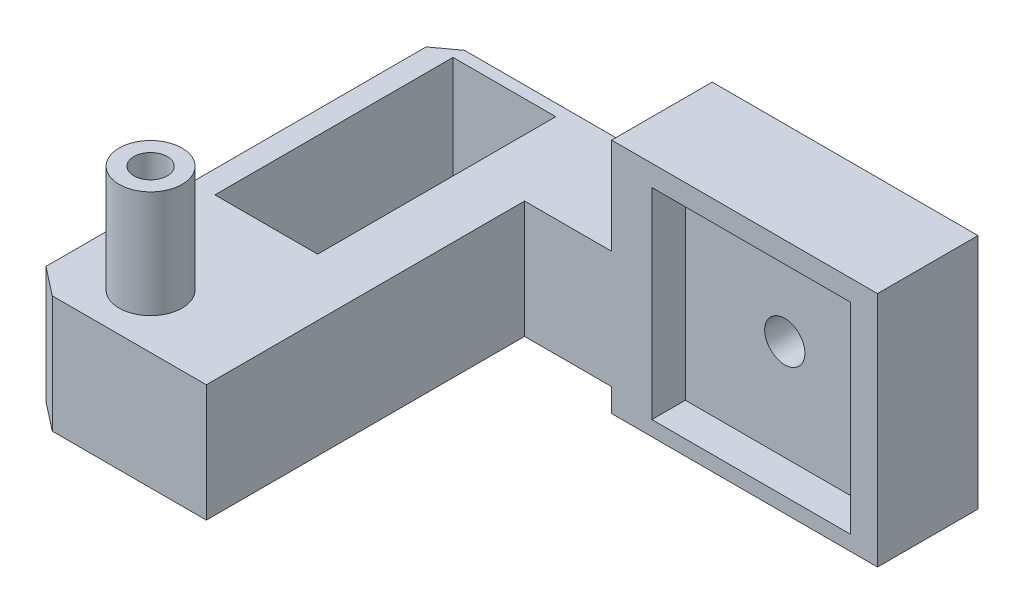
ISO-10303-21;
HEADER;
FILE_DESCRIPTION(('STEP AP214'),'2;1');
FILE_NAME('part.step','',(''),(''),'','','');
FILE_SCHEMA(('AUTOMOTIVE_DESIGN { 1 0 10303 214 1 1 1 1 }'));
ENDSEC;
DATA;
#1=APPLICATION_CONTEXT('core data for automotive mechanical design processes');
#2=APPLICATION_PROTOCOL_DEFINITION('international standard','automotive_design',2000,#1);
#3=PRODUCT_CONTEXT('',#1,'mechanical');
#4=PRODUCT('Part','Part','',(#3));
#5=PRODUCT_RELATED_PRODUCT_CATEGORY('part','',(#4));
#6=PRODUCT_DEFINITION_FORMATION('','',#4);
#7=PRODUCT_DEFINITION_CONTEXT('part definition',#1,'design');
#8=PRODUCT_DEFINITION('design','',#6,#7);
#9=PRODUCT_DEFINITION_SHAPE('','',#8);
#10=(LENGTH_UNIT() NAMED_UNIT(*) SI_UNIT(.MILLI.,.METRE.));
#11=(NAMED_UNIT(*) PLANE_ANGLE_UNIT() SI_UNIT($,.RADIAN.));
#12=(NAMED_UNIT(*) SI_UNIT($,.STERADIAN.) SOLID_ANGLE_UNIT());
#13=UNCERTAINTY_MEASURE_WITH_UNIT(LENGTH_MEASURE(1.E-05),#10,'distance_accuracy_value','');
#14=(GEOMETRIC_REPRESENTATION_CONTEXT(3) GLOBAL_UNCERTAINTY_ASSIGNED_CONTEXT((#13)) GLOBAL_UNIT_ASSIGNED_CONTEXT((#10,
#11,#12)) REPRESENTATION_CONTEXT('',''));
#15=CARTESIAN_POINT('',(0.,0.,0.));
#16=DIRECTION('',(0.,0.,1.));
#17=DIRECTION('',(1.,0.,0.));
#18=AXIS2_PLACEMENT_3D('',#15,#16,#17);
#19=CARTESIAN_POINT('',(-41.2496020360594,-0.64025842156578,0.));
#20=DIRECTION('',(0.,0.,-1.));
#21=DIRECTION('',(-1.,0.,0.));
#22=AXIS2_PLACEMENT_3D('',#19,#20,#21);
#23=PLANE('',#22);
#24=CARTESIAN_POINT('',(-19.4108071751715,13.1097415784342,0.));
#25=DIRECTION('',(0.,0.,1.));
#26=DIRECTION('',(1.,0.,0.));
#27=AXIS2_PLACEMENT_3D('',#24,#25,#26);
#28=CIRCLE('',#27,3.);
#29=CARTESIAN_POINT('',(-16.4108071751715,13.1097415784342,0.));
#30=VERTEX_POINT('',#29);
#31=EDGE_CURVE('E274',#30,#30,#28,.T.);
#32=ORIENTED_EDGE('',*,*,#31,.T.);
#33=EDGE_LOOP('',(#32));
#34=FACE_BOUND('',#33,.T.);
#35=DIRECTION('',(0.,-1.,0.));
#36=VECTOR('',#35,1.);
#37=CARTESIAN_POINT('',(-40.2496020360594,-0.640258421565783,0.));
#38=LINE('',#37,#36);
#39=CARTESIAN_POINT('',(-40.2496020360594,-0.640258421565783,0.));
#40=VERTEX_POINT('',#39);
#41=CARTESIAN_POINT('',(-40.2496020360594,-4.11880183674536,0.));
#42=VERTEX_POINT('',#41);
#43=EDGE_CURVE('E282',#40,#42,#38,.T.);
#44=ORIENTED_EDGE('',*,*,#43,.F.);
#45=DIRECTION('',(-1.,0.,0.));
#46=VECTOR('',#45,1.);
#47=CARTESIAN_POINT('',(-41.2496020360594,-0.64025842156578,0.));
#48=LINE('',#47,#46);
#49=CARTESIAN_POINT('',(-77.2205527939733,-0.64025842156578,0.));
#50=VERTEX_POINT('',#49);
#51=EDGE_CURVE('E410',#40,#50,#48,.T.);
#52=ORIENTED_EDGE('',*,*,#51,.T.);
#53=DIRECTION('',(0.,1.,0.));
#54=VECTOR('',#53,1.);
#55=CARTESIAN_POINT('',(-77.2205527939733,-38.1402584215658,0.));
#56=LINE('',#55,#54);
#57=CARTESIAN_POINT('',(-77.2205527939733,16.8597415784342,0.));
#58=VERTEX_POINT('',#57);
#59=EDGE_CURVE('E404',#50,#58,#56,.T.);
#60=ORIENTED_EDGE('',*,*,#59,.T.);
#61=DIRECTION('',(-1.,0.,0.));
#62=VECTOR('',#61,1.);
#63=CARTESIAN_POINT('',(-41.2496020360594,16.8597415784342,0.));
#64=LINE('',#63,#62);
#65=CARTESIAN_POINT('',(-40.2496020360594,16.8597415784342,0.));
#66=VERTEX_POINT('',#65);
#67=EDGE_CURVE('E409',#66,#58,#64,.T.);
#68=ORIENTED_EDGE('',*,*,#67,.F.);
#69=DIRECTION('',(0.,-1.,0.));
#70=VECTOR('',#69,1.);
#71=CARTESIAN_POINT('',(-40.2496020360594,26.2347415784342,0.));
#72=LINE('',#71,#70);
#73=CARTESIAN_POINT('',(-40.2496020360594,31.2347415784342,0.));
#74=VERTEX_POINT('',#73);
#75=EDGE_CURVE('E330',#74,#66,#72,.T.);
#76=ORIENTED_EDGE('',*,*,#75,.F.);
#77=DIRECTION('',(-1.,0.,0.));
#78=VECTOR('',#77,1.);
#79=CARTESIAN_POINT('',(-40.2496020360594,31.2347415784342,0.));
#80=LINE('',#79,#78);
#81=CARTESIAN_POINT('',(-0.572012314283669,31.2347415784342,0.));
#82=VERTEX_POINT('',#81);
#83=EDGE_CURVE('E315',#82,#74,#80,.T.);
#84=ORIENTED_EDGE('',*,*,#83,.F.);
#85=DIRECTION('',(0.,1.,0.));
#86=VECTOR('',#85,1.);
#87=CARTESIAN_POINT('',(-0.572012314283669,31.2347415784342,0.));
#88=LINE('',#87,#86);
#89=CARTESIAN_POINT('',(-0.572012314283663,-4.11880183674536,0.));
#90=VERTEX_POINT('',#89);
#91=EDGE_CURVE('E266',#90,#82,#88,.T.);
#92=ORIENTED_EDGE('',*,*,#91,.F.);
#93=DIRECTION('',(1.,0.,0.));
#94=VECTOR('',#93,1.);
#95=CARTESIAN_POINT('',(-40.2496020360594,-4.11880183674536,0.));
#96=LINE('',#95,#94);
#97=EDGE_CURVE('E256',#42,#90,#96,.T.);
#98=ORIENTED_EDGE('',*,*,#97,.F.);
#99=EDGE_LOOP('',(#44,#52,#60,#68,#76,#84,#92,#98));
#100=FACE_BOUND('',#99,.T.);
#101=ADVANCED_FACE('F107',(#34,#100),#23,.T.);
#102=CARTESIAN_POINT('',(0.,0.,15.));
#103=DIRECTION('',(0.,0.,1.));
#104=DIRECTION('',(1.,0.,0.));
#105=AXIS2_PLACEMENT_3D('',#102,#103,#104);
#106=PLANE('',#105);
#107=DIRECTION('',(-1.,0.,0.));
#108=VECTOR('',#107,1.);
#109=CARTESIAN_POINT('',(-34.2496020360594,28.1097415784342,15.));
#110=LINE('',#109,#108);
#111=CARTESIAN_POINT('',(-4.57201231428367,28.1097415784342,15.));
#112=VERTEX_POINT('',#111);
#113=CARTESIAN_POINT('',(-34.2496020360594,28.1097415784342,15.));
#114=VERTEX_POINT('',#113);
#115=EDGE_CURVE('E296',#112,#114,#110,.T.);
#116=ORIENTED_EDGE('',*,*,#115,.F.);
#117=DIRECTION('',(0.,-1.,0.));
#118=VECTOR('',#117,1.);
#119=CARTESIAN_POINT('',(-4.57201231428367,31.2347415784342,15.));
#120=LINE('',#119,#118);
#121=CARTESIAN_POINT('',(-4.57201231428366,-1.89025842156578,15.));
#122=VERTEX_POINT('',#121);
#123=EDGE_CURVE('E271',#112,#122,#120,.T.);
#124=ORIENTED_EDGE('',*,*,#123,.T.);
#125=DIRECTION('',(1.,0.,0.));
#126=VECTOR('',#125,1.);
#127=CARTESIAN_POINT('',(-34.2496020360594,-1.89025842156578,15.));
#128=LINE('',#127,#126);
#129=CARTESIAN_POINT('',(-34.2496020360594,-1.89025842156578,15.));
#130=VERTEX_POINT('',#129);
#131=EDGE_CURVE('E303',#130,#122,#128,.T.);
#132=ORIENTED_EDGE('',*,*,#131,.F.);
#133=DIRECTION('',(0.,-1.,0.));
#134=VECTOR('',#133,1.);
#135=CARTESIAN_POINT('',(-34.2496020360594,28.1097415784342,15.));
#136=LINE('',#135,#134);
#137=EDGE_CURVE('E293',#114,#130,#136,.T.);
#138=ORIENTED_EDGE('',*,*,#137,.F.);
#139=EDGE_LOOP('',(#116,#124,#132,#138));
#140=FACE_BOUND('',#139,.T.);
#141=DIRECTION('',(0.,1.,0.));
#142=VECTOR('',#141,1.);
#143=CARTESIAN_POINT('',(-53.2496020360594,-19.3902584215658,15.));
#144=LINE('',#143,#142);
#145=CARTESIAN_POINT('',(-53.2496020360594,-0.640258421565783,15.));
#146=VERTEX_POINT('',#145);
#147=CARTESIAN_POINT('',(-53.2496020360594,16.8597415784342,15.));
#148=VERTEX_POINT('',#147);
#149=EDGE_CURVE('E352',#146,#148,#144,.T.);
#150=ORIENTED_EDGE('',*,*,#149,.F.);
#151=DIRECTION('',(1.,0.,0.));
#152=VECTOR('',#151,1.);
#153=CARTESIAN_POINT('',(-53.2496020360594,-0.640258421565783,15.));
#154=LINE('',#153,#152);
#155=CARTESIAN_POINT('',(-40.2496020360594,-0.640258421565783,15.));
#156=VERTEX_POINT('',#155);
#157=EDGE_CURVE('E286',#146,#156,#154,.T.);
#158=ORIENTED_EDGE('',*,*,#157,.T.);
#159=DIRECTION('',(0.,-1.,0.));
#160=VECTOR('',#159,1.);
#161=CARTESIAN_POINT('',(-40.2496020360594,-0.640258421565783,15.));
#162=LINE('',#161,#160);
#163=CARTESIAN_POINT('',(-40.2496020360594,-4.11880183674536,15.));
#164=VERTEX_POINT('',#163);
#165=EDGE_CURVE('E254',#156,#164,#162,.T.);
#166=ORIENTED_EDGE('',*,*,#165,.T.);
#167=DIRECTION('',(1.,0.,0.));
#168=VECTOR('',#167,1.);
#169=CARTESIAN_POINT('',(-40.2496020360594,-4.11880183674536,15.));
#170=LINE('',#169,#168);
#171=CARTESIAN_POINT('',(-0.572012314283663,-4.11880183674536,15.));
#172=VERTEX_POINT('',#171);
#173=EDGE_CURVE('E245',#164,#172,#170,.T.);
#174=ORIENTED_EDGE('',*,*,#173,.T.);
#175=DIRECTION('',(0.,-1.,0.));
#176=VECTOR('',#175,1.);
#177=CARTESIAN_POINT('',(-0.572012314283669,31.2347415784342,15.));
#178=LINE('',#177,#176);
#179=CARTESIAN_POINT('',(-0.572012314283669,31.2347415784342,15.));
#180=VERTEX_POINT('',#179);
#181=EDGE_CURVE('E251',#180,#172,#178,.T.);
#182=ORIENTED_EDGE('',*,*,#181,.F.);
#183=DIRECTION('',(1.,0.,0.));
#184=VECTOR('',#183,1.);
#185=CARTESIAN_POINT('',(-40.2496020360594,31.2347415784342,15.));
#186=LINE('',#185,#184);
#187=CARTESIAN_POINT('',(-40.2496020360594,31.2347415784342,15.));
#188=VERTEX_POINT('',#187);
#189=EDGE_CURVE('E313',#188,#180,#186,.T.);
#190=ORIENTED_EDGE('',*,*,#189,.F.);
#191=DIRECTION('',(0.,1.,0.));
#192=VECTOR('',#191,1.);
#193=CARTESIAN_POINT('',(-40.2496020360594,26.2347415784342,15.));
#194=LINE('',#193,#192);
#195=CARTESIAN_POINT('',(-40.2496020360594,16.8597415784342,15.));
#196=VERTEX_POINT('',#195);
#197=EDGE_CURVE('E336',#196,#188,#194,.T.);
#198=ORIENTED_EDGE('',*,*,#197,.F.);
#199=DIRECTION('',(-1.,0.,0.));
#200=VECTOR('',#199,1.);
#201=CARTESIAN_POINT('',(-40.2496020360594,16.8597415784342,15.));
#202=LINE('',#201,#200);
#203=EDGE_CURVE('E338',#196,#148,#202,.T.);
#204=ORIENTED_EDGE('',*,*,#203,.T.);
#205=EDGE_LOOP('',(#150,#158,#166,#174,#182,#190,#198,#204));
#206=FACE_BOUND('',#205,.T.);
#207=ADVANCED_FACE('F248',(#140,#206),#106,.T.);
#208=CARTESIAN_POINT('',(0.,16.8597415784342,0.));
#209=DIRECTION('',(0.,1.,0.));
#210=DIRECTION('',(0.,0.,1.));
#211=AXIS2_PLACEMENT_3D('',#208,#209,#210);
#212=PLANE('',#211);
#213=DIRECTION('',(-0.78801075360672,0.,-0.615661475325662));
#214=VECTOR('',#213,1.);
#215=CARTESIAN_POINT('',(-76.2496020360594,16.8597415784342,62.5));
#216=LINE('',#215,#214);
#217=CARTESIAN_POINT('',(-76.2496020360594,16.8597415784342,62.5));
#218=VERTEX_POINT('',#217);
#219=CARTESIAN_POINT('',(-80.5211135654095,16.8597415784342,59.162729438661));
#220=VERTEX_POINT('',#219);
#221=EDGE_CURVE('E129',#218,#220,#216,.T.);
#222=ORIENTED_EDGE('',*,*,#221,.F.);
#223=DIRECTION('',(-1.,0.,0.));
#224=VECTOR('',#223,1.);
#225=CARTESIAN_POINT('',(-53.2496020360594,16.8597415784342,62.5));
#226=LINE('',#225,#224);
#227=CARTESIAN_POINT('',(-53.2496020360594,16.8597415784342,62.5));
#228=VERTEX_POINT('',#227);
#229=EDGE_CURVE('E318',#228,#218,#226,.T.);
#230=ORIENTED_EDGE('',*,*,#229,.F.);
#231=DIRECTION('',(0.,0.,1.));
#232=VECTOR('',#231,1.);
#233=CARTESIAN_POINT('',(-53.2496020360594,16.8597415784342,15.));
#234=LINE('',#233,#232);
#235=EDGE_CURVE('E349',#148,#228,#234,.T.);
#236=ORIENTED_EDGE('',*,*,#235,.F.);
#237=ORIENTED_EDGE('',*,*,#203,.F.);
#238=DIRECTION('',(0.,0.,1.));
#239=VECTOR('',#238,1.);
#240=CARTESIAN_POINT('',(-40.2496020360594,16.8597415784342,0.));
#241=LINE('',#240,#239);
#242=EDGE_CURVE('E333',#66,#196,#241,.T.);
#243=ORIENTED_EDGE('',*,*,#242,.F.);
#244=ORIENTED_EDGE('',*,*,#67,.T.);
#245=DIRECTION('',(0.805892368460767,0.,-0.592062066388901));
#246=VECTOR('',#245,1.);
#247=CARTESIAN_POINT('',(-111.249602036059,16.8597415784342,25.));
#248=LINE('',#247,#246);
#249=CARTESIAN_POINT('',(-80.5211135654095,16.8597415784342,2.42481118702119));
#250=VERTEX_POINT('',#249);
#251=EDGE_CURVE('E402',#250,#58,#248,.T.);
#252=ORIENTED_EDGE('',*,*,#251,.F.);
#253=DIRECTION('',(0.,0.,1.));
#254=VECTOR('',#253,1.);
#255=CARTESIAN_POINT('',(-80.5211135654095,16.8597415784342,0.));
#256=LINE('',#255,#254);
#257=EDGE_CURVE('E340',#250,#220,#256,.T.);
#258=ORIENTED_EDGE('',*,*,#257,.T.);
#259=EDGE_LOOP('',(#222,#230,#236,#237,#243,#244,#252,#258));
#260=FACE_BOUND('',#259,.T.);
#261=CARTESIAN_POINT('',(-69.6655804044999,16.8597415784342,54.408733969364));
#262=DIRECTION('',(0.,1.,0.));
#263=DIRECTION('',(0.,0.,1.));
#264=AXIS2_PLACEMENT_3D('',#261,#262,#263);
#265=CIRCLE('',#264,4.69999999999999);
#266=CARTESIAN_POINT('',(-69.6655804044999,16.8597415784342,59.108733969364));
#267=VERTEX_POINT('',#266);
#268=EDGE_CURVE('E362',#267,#267,#265,.T.);
#269=ORIENTED_EDGE('',*,*,#268,.F.);
#270=EDGE_LOOP('',(#269));
#271=FACE_BOUND('',#270,.T.);
#272=DIRECTION('',(0.,0.,1.));
#273=VECTOR('',#272,1.);
#274=CARTESIAN_POINT('',(-77.1593566180115,16.8597415784342,1.77200194125743));
#275=LINE('',#274,#273);
#276=CARTESIAN_POINT('',(-77.1593566180115,16.8597415784342,1.77200194125743));
#277=VERTEX_POINT('',#276);
#278=CARTESIAN_POINT('',(-77.1593566180115,16.8597415784342,37.3148076618371));
#279=VERTEX_POINT('',#278);
#280=EDGE_CURVE('E368',#277,#279,#275,.T.);
#281=ORIENTED_EDGE('',*,*,#280,.F.);
#282=DIRECTION('',(-1.,0.,0.));
#283=VECTOR('',#282,1.);
#284=CARTESIAN_POINT('',(-77.1593566180115,16.8597415784342,1.77200194125743));
#285=LINE('',#284,#283);
#286=CARTESIAN_POINT('',(-61.8250269618374,16.8597415784342,1.77200194125743));
#287=VERTEX_POINT('',#286);
#288=EDGE_CURVE('E378',#287,#277,#285,.T.);
#289=ORIENTED_EDGE('',*,*,#288,.F.);
#290=DIRECTION('',(0.,0.,-1.));
#291=VECTOR('',#290,1.);
#292=CARTESIAN_POINT('',(-61.8250269618374,16.8597415784342,1.77200194125743));
#293=LINE('',#292,#291);
#294=CARTESIAN_POINT('',(-61.8250269618374,16.8597415784342,37.3148076618371));
#295=VERTEX_POINT('',#294);
#296=EDGE_CURVE('E375',#295,#287,#293,.T.);
#297=ORIENTED_EDGE('',*,*,#296,.F.);
#298=DIRECTION('',(1.,0.,0.));
#299=VECTOR('',#298,1.);
#300=CARTESIAN_POINT('',(-77.1593566180115,16.8597415784342,37.3148076618371));
#301=LINE('',#300,#299);
#302=EDGE_CURVE('E372',#279,#295,#301,.T.);
#303=ORIENTED_EDGE('',*,*,#302,.F.);
#304=EDGE_LOOP('',(#281,#289,#297,#303));
#305=FACE_BOUND('',#304,.T.);
#306=ADVANCED_FACE('F460',(#260,#271,#305),#212,.T.);
#307=CARTESIAN_POINT('',(0.,-0.64025842156578,0.));
#308=DIRECTION('',(0.,1.,0.));
#309=DIRECTION('',(0.,0.,1.));
#310=AXIS2_PLACEMENT_3D('',#307,#308,#309);
#311=PLANE('',#310);
#312=DIRECTION('',(-1.,0.,0.));
#313=VECTOR('',#312,1.);
#314=CARTESIAN_POINT('',(0.,-0.64025842156578,1.77200194125743));
#315=LINE('',#314,#313);
#316=CARTESIAN_POINT('',(-61.8250269618374,-0.64025842156578,1.77200194125743));
#317=VERTEX_POINT('',#316);
#318=CARTESIAN_POINT('',(-77.1593566180115,-0.64025842156578,1.77200194125743));
#319=VERTEX_POINT('',#318);
#320=EDGE_CURVE('E396',#317,#319,#315,.T.);
#321=ORIENTED_EDGE('',*,*,#320,.T.);
#322=DIRECTION('',(0.,0.,1.));
#323=VECTOR('',#322,1.);
#324=CARTESIAN_POINT('',(-77.1593566180115,-0.64025842156578,0.));
#325=LINE('',#324,#323);
#326=CARTESIAN_POINT('',(-77.1593566180115,-0.64025842156578,37.3148076618371));
#327=VERTEX_POINT('',#326);
#328=EDGE_CURVE('E399',#319,#327,#325,.T.);
#329=ORIENTED_EDGE('',*,*,#328,.T.);
#330=DIRECTION('',(1.,0.,0.));
#331=VECTOR('',#330,1.);
#332=CARTESIAN_POINT('',(0.,-0.64025842156578,37.3148076618371));
#333=LINE('',#332,#331);
#334=CARTESIAN_POINT('',(-61.8250269618374,-0.64025842156578,37.3148076618371));
#335=VERTEX_POINT('',#334);
#336=EDGE_CURVE('E384',#327,#335,#333,.T.);
#337=ORIENTED_EDGE('',*,*,#336,.T.);
#338=DIRECTION('',(0.,0.,-1.));
#339=VECTOR('',#338,1.);
#340=CARTESIAN_POINT('',(-61.8250269618374,-0.64025842156578,0.));
#341=LINE('',#340,#339);
#342=EDGE_CURVE('E393',#335,#317,#341,.T.);
#343=ORIENTED_EDGE('',*,*,#342,.T.);
#344=EDGE_LOOP('',(#321,#329,#337,#343));
#345=FACE_BOUND('',#344,.T.);
#346=DIRECTION('',(-1.,0.,0.));
#347=VECTOR('',#346,1.);
#348=CARTESIAN_POINT('',(0.,-0.64025842156578,62.5));
#349=LINE('',#348,#347);
#350=CARTESIAN_POINT('',(-53.2496020360594,-0.640258421565783,62.5));
#351=VERTEX_POINT('',#350);
#352=CARTESIAN_POINT('',(-76.2496020360594,-0.640258421565783,62.5));
#353=VERTEX_POINT('',#352);
#354=EDGE_CURVE('E327',#351,#353,#349,.T.);
#355=ORIENTED_EDGE('',*,*,#354,.T.);
#356=DIRECTION('',(-0.78801075360672,0.,-0.615661475325662));
#357=VECTOR('',#356,1.);
#358=CARTESIAN_POINT('',(-59.223318332513,-0.64025842156578,75.8023907304064));
#359=LINE('',#358,#357);
#360=CARTESIAN_POINT('',(-80.5211135654095,-0.640258421565787,59.162729438661));
#361=VERTEX_POINT('',#360);
#362=EDGE_CURVE('E324',#353,#361,#359,.T.);
#363=ORIENTED_EDGE('',*,*,#362,.T.);
#364=DIRECTION('',(0.,0.,1.));
#365=VECTOR('',#364,1.);
#366=CARTESIAN_POINT('',(-80.5211135654095,-0.64025842156578,0.));
#367=LINE('',#366,#365);
#368=CARTESIAN_POINT('',(-80.5211135654095,-0.640258421565783,2.42481118702119));
#369=VERTEX_POINT('',#368);
#370=EDGE_CURVE('E346',#369,#361,#367,.T.);
#371=ORIENTED_EDGE('',*,*,#370,.F.);
#372=DIRECTION('',(0.805892368460767,0.,-0.592062066388901));
#373=VECTOR('',#372,1.);
#374=CARTESIAN_POINT('',(-27.0686987880782,-0.64025842156578,-36.8448833591483));
#375=LINE('',#374,#373);
#376=EDGE_CURVE('E407',#369,#50,#375,.T.);
#377=ORIENTED_EDGE('',*,*,#376,.T.);
#378=ORIENTED_EDGE('',*,*,#51,.F.);
#379=DIRECTION('',(0.,0.,1.));
#380=VECTOR('',#379,1.);
#381=CARTESIAN_POINT('',(-40.2496020360594,-0.640258421565783,0.));
#382=LINE('',#381,#380);
#383=EDGE_CURVE('E285',#40,#156,#382,.T.);
#384=ORIENTED_EDGE('',*,*,#383,.T.);
#385=ORIENTED_EDGE('',*,*,#157,.F.);
#386=DIRECTION('',(0.,0.,1.));
#387=VECTOR('',#386,1.);
#388=CARTESIAN_POINT('',(-53.2496020360594,-0.64025842156578,0.));
#389=LINE('',#388,#387);
#390=EDGE_CURVE('E355',#146,#351,#389,.T.);
#391=ORIENTED_EDGE('',*,*,#390,.T.);
#392=EDGE_LOOP('',(#355,#363,#371,#377,#378,#384,#385,#391));
#393=FACE_BOUND('',#392,.T.);
#394=ADVANCED_FACE('F470',(#345,#393),#311,.F.);
#395=CARTESIAN_POINT('',(-111.249602036059,-38.1402584215658,25.));
#396=DIRECTION('',(0.592062066388901,0.,0.805892368460767));
#397=DIRECTION('',(0.805892368460767,0.,-0.592062066388901));
#398=AXIS2_PLACEMENT_3D('',#395,#396,#397);
#399=PLANE('',#398);
#400=DIRECTION('',(0.,1.,0.));
#401=VECTOR('',#400,1.);
#402=CARTESIAN_POINT('',(-80.5211135654095,-10.0152584215658,2.42481118702119));
#403=LINE('',#402,#401);
#404=EDGE_CURVE('E343',#369,#250,#403,.T.);
#405=ORIENTED_EDGE('',*,*,#404,.T.);
#406=ORIENTED_EDGE('',*,*,#251,.T.);
#407=ORIENTED_EDGE('',*,*,#59,.F.);
#408=ORIENTED_EDGE('',*,*,#376,.F.);
#409=EDGE_LOOP('',(#405,#406,#407,#408));
#410=FACE_BOUND('',#409,.T.);
#411=ADVANCED_FACE('F475',(#410),#399,.F.);
#412=CARTESIAN_POINT('',(-77.1593566180115,-38.1402584215658,1.77200194125743));
#413=DIRECTION('',(-1.,0.,0.));
#414=DIRECTION('',(0.,0.,1.));
#415=AXIS2_PLACEMENT_3D('',#412,#413,#414);
#416=PLANE('',#415);
#417=DIRECTION('',(0.,1.,0.));
#418=VECTOR('',#417,1.);
#419=CARTESIAN_POINT('',(-77.1593566180115,-38.1402584215658,1.77200194125743));
#420=LINE('',#419,#418);
#421=EDGE_CURVE('E382',#319,#277,#420,.T.);
#422=ORIENTED_EDGE('',*,*,#421,.T.);
#423=ORIENTED_EDGE('',*,*,#280,.T.);
#424=DIRECTION('',(0.,1.,0.));
#425=VECTOR('',#424,1.);
#426=CARTESIAN_POINT('',(-77.1593566180115,-38.1402584215658,37.3148076618371));
#427=LINE('',#426,#425);
#428=EDGE_CURVE('E381',#327,#279,#427,.T.);
#429=ORIENTED_EDGE('',*,*,#428,.F.);
#430=ORIENTED_EDGE('',*,*,#328,.F.);
#431=EDGE_LOOP('',(#422,#423,#429,#430));
#432=FACE_BOUND('',#431,.T.);
#433=ADVANCED_FACE('F532',(#432),#416,.F.);
#434=CARTESIAN_POINT('',(-77.1593566180115,-38.1402584215658,1.77200194125743));
#435=DIRECTION('',(0.,0.,-1.));
#436=DIRECTION('',(-1.,0.,0.));
#437=AXIS2_PLACEMENT_3D('',#434,#435,#436);
#438=PLANE('',#437);
#439=DIRECTION('',(0.,1.,0.));
#440=VECTOR('',#439,1.);
#441=CARTESIAN_POINT('',(-61.8250269618374,-38.1402584215658,1.77200194125743));
#442=LINE('',#441,#440);
#443=EDGE_CURVE('E385',#317,#287,#442,.T.);
#444=ORIENTED_EDGE('',*,*,#443,.T.);
#445=ORIENTED_EDGE('',*,*,#288,.T.);
#446=ORIENTED_EDGE('',*,*,#421,.F.);
#447=ORIENTED_EDGE('',*,*,#320,.F.);
#448=EDGE_LOOP('',(#444,#445,#446,#447));
#449=FACE_BOUND('',#448,.T.);
#450=ADVANCED_FACE('F528',(#449),#438,.F.);
#451=CARTESIAN_POINT('',(-61.8250269618374,-38.1402584215658,1.77200194125743));
#452=DIRECTION('',(1.,0.,0.));
#453=DIRECTION('',(0.,0.,-1.));
#454=AXIS2_PLACEMENT_3D('',#451,#452,#453);
#455=PLANE('',#454);
#456=DIRECTION('',(0.,1.,0.));
#457=VECTOR('',#456,1.);
#458=CARTESIAN_POINT('',(-61.8250269618374,-38.1402584215658,37.3148076618371));
#459=LINE('',#458,#457);
#460=EDGE_CURVE('E387',#335,#295,#459,.T.);
#461=ORIENTED_EDGE('',*,*,#460,.T.);
#462=ORIENTED_EDGE('',*,*,#296,.T.);
#463=ORIENTED_EDGE('',*,*,#443,.F.);
#464=ORIENTED_EDGE('',*,*,#342,.F.);
#465=EDGE_LOOP('',(#461,#462,#463,#464));
#466=FACE_BOUND('',#465,.T.);
#467=ADVANCED_FACE('F531',(#466),#455,.F.);
#468=CARTESIAN_POINT('',(-77.1593566180115,-38.1402584215658,37.3148076618371));
#469=DIRECTION('',(0.,0.,1.));
#470=DIRECTION('',(1.,0.,0.));
#471=AXIS2_PLACEMENT_3D('',#468,#469,#470);
#472=PLANE('',#471);
#473=ORIENTED_EDGE('',*,*,#428,.T.);
#474=ORIENTED_EDGE('',*,*,#302,.T.);
#475=ORIENTED_EDGE('',*,*,#460,.F.);
#476=ORIENTED_EDGE('',*,*,#336,.F.);
#477=EDGE_LOOP('',(#473,#474,#475,#476));
#478=FACE_BOUND('',#477,.T.);
#479=ADVANCED_FACE('F526',(#478),#472,.F.);
#480=CARTESIAN_POINT('',(-69.6655804044999,32.8597415784342,54.408733969364));
#481=DIRECTION('',(0.,-1.,0.));
#482=DIRECTION('',(0.,0.,-1.));
#483=AXIS2_PLACEMENT_3D('',#480,#481,#482);
#484=CYLINDRICAL_SURFACE('',#483,4.69999999999999);
#485=CARTESIAN_POINT('',(-69.6655804044999,32.8597415784342,54.408733969364));
#486=DIRECTION('',(0.,1.,0.));
#487=DIRECTION('',(0.,0.,1.));
#488=AXIS2_PLACEMENT_3D('',#485,#486,#487);
#489=CIRCLE('',#488,4.69999999999999);
#490=CARTESIAN_POINT('',(-69.6655804044999,32.8597415784342,59.108733969364));
#491=VERTEX_POINT('',#490);
#492=EDGE_CURVE('E365',#491,#491,#489,.T.);
#493=ORIENTED_EDGE('',*,*,#492,.F.);
#494=EDGE_LOOP('',(#493));
#495=FACE_BOUND('',#494,.T.);
#496=ORIENTED_EDGE('',*,*,#268,.T.);
#497=EDGE_LOOP('',(#496));
#498=FACE_BOUND('',#497,.T.);
#499=ADVANCED_FACE('F522',(#495,#498),#484,.T.);
#500=CARTESIAN_POINT('',(-69.6655804044999,32.8597415784342,54.408733969364));
#501=DIRECTION('',(0.,1.,0.));
#502=DIRECTION('',(0.,0.,1.));
#503=AXIS2_PLACEMENT_3D('',#500,#501,#502);
#504=PLANE('',#503);
#505=CARTESIAN_POINT('',(-69.6655804044999,32.8597415784342,54.408733969364));
#506=DIRECTION('',(0.,1.,0.));
#507=DIRECTION('',(0.,0.,1.));
#508=AXIS2_PLACEMENT_3D('',#505,#506,#507);
#509=CIRCLE('',#508,2.5);
#510=CARTESIAN_POINT('',(-69.6655804044999,32.8597415784342,56.908733969364));
#511=VERTEX_POINT('',#510);
#512=EDGE_CURVE('E358',#511,#511,#509,.T.);
#513=ORIENTED_EDGE('',*,*,#512,.F.);
#514=EDGE_LOOP('',(#513));
#515=FACE_BOUND('',#514,.T.);
#516=ORIENTED_EDGE('',*,*,#492,.T.);
#517=EDGE_LOOP('',(#516));
#518=FACE_BOUND('',#517,.T.);
#519=ADVANCED_FACE('F518',(#515,#518),#504,.T.);
#520=CARTESIAN_POINT('',(-69.6655804044999,22.8597415784342,54.408733969364));
#521=DIRECTION('',(0.,1.,0.));
#522=DIRECTION('',(0.,0.,1.));
#523=AXIS2_PLACEMENT_3D('',#520,#521,#522);
#524=CYLINDRICAL_SURFACE('',#523,2.5);
#525=CARTESIAN_POINT('',(-69.6655804044999,22.8597415784342,54.408733969364));
#526=DIRECTION('',(0.,1.,0.));
#527=DIRECTION('',(0.,0.,1.));
#528=AXIS2_PLACEMENT_3D('',#525,#526,#527);
#529=CIRCLE('',#528,2.5);
#530=CARTESIAN_POINT('',(-69.6655804044999,22.8597415784342,56.908733969364));
#531=VERTEX_POINT('',#530);
#532=EDGE_CURVE('E359',#531,#531,#529,.T.);
#533=ORIENTED_EDGE('',*,*,#532,.F.);
#534=EDGE_LOOP('',(#533));
#535=FACE_BOUND('',#534,.T.);
#536=ORIENTED_EDGE('',*,*,#512,.T.);
#537=EDGE_LOOP('',(#536));
#538=FACE_BOUND('',#537,.T.);
#539=ADVANCED_FACE('F514',(#535,#538),#524,.F.);
#540=CARTESIAN_POINT('',(-69.6655804044999,22.8597415784342,54.408733969364));
#541=DIRECTION('',(0.,1.,0.));
#542=DIRECTION('',(0.,0.,1.));
#543=AXIS2_PLACEMENT_3D('',#540,#541,#542);
#544=PLANE('',#543);
#545=ORIENTED_EDGE('',*,*,#532,.T.);
#546=EDGE_LOOP('',(#545));
#547=FACE_BOUND('',#546,.T.);
#548=ADVANCED_FACE('F510',(#547),#544,.T.);
#549=CARTESIAN_POINT('',(-53.2496020360594,-19.3902584215658,15.));
#550=DIRECTION('',(-1.,0.,0.));
#551=DIRECTION('',(0.,0.,1.));
#552=AXIS2_PLACEMENT_3D('',#549,#550,#551);
#553=PLANE('',#552);
#554=ORIENTED_EDGE('',*,*,#235,.T.);
#555=DIRECTION('',(0.,-1.,0.));
#556=VECTOR('',#555,1.);
#557=CARTESIAN_POINT('',(-53.2496020360594,-19.3902584215658,62.5));
#558=LINE('',#557,#556);
#559=EDGE_CURVE('E417',#228,#351,#558,.T.);
#560=ORIENTED_EDGE('',*,*,#559,.T.);
#561=ORIENTED_EDGE('',*,*,#390,.F.);
#562=ORIENTED_EDGE('',*,*,#149,.T.);
#563=EDGE_LOOP('',(#554,#560,#561,#562));
#564=FACE_BOUND('',#563,.T.);
#565=ADVANCED_FACE('F488',(#564),#553,.F.);
#566=CARTESIAN_POINT('',(-80.5211135654095,-10.0152584215658,0.));
#567=DIRECTION('',(-1.,0.,0.));
#568=DIRECTION('',(0.,0.,1.));
#569=AXIS2_PLACEMENT_3D('',#566,#567,#568);
#570=PLANE('',#569);
#571=DIRECTION('',(0.,-1.,0.));
#572=VECTOR('',#571,1.);
#573=CARTESIAN_POINT('',(-80.5211135654095,-10.0152584215658,59.162729438661));
#574=LINE('',#573,#572);
#575=EDGE_CURVE('E413',#220,#361,#574,.T.);
#576=ORIENTED_EDGE('',*,*,#575,.F.);
#577=ORIENTED_EDGE('',*,*,#257,.F.);
#578=ORIENTED_EDGE('',*,*,#404,.F.);
#579=ORIENTED_EDGE('',*,*,#370,.T.);
#580=EDGE_LOOP('',(#576,#577,#578,#579));
#581=FACE_BOUND('',#580,.T.);
#582=ADVANCED_FACE('F494',(#581),#570,.T.);
#583=CARTESIAN_POINT('',(-40.2496020360594,0.,0.));
#584=DIRECTION('',(-1.,0.,0.));
#585=DIRECTION('',(0.,0.,1.));
#586=AXIS2_PLACEMENT_3D('',#583,#584,#585);
#587=PLANE('',#586);
#588=ORIENTED_EDGE('',*,*,#75,.T.);
#589=ORIENTED_EDGE('',*,*,#242,.T.);
#590=ORIENTED_EDGE('',*,*,#197,.T.);
#591=DIRECTION('',(0.,0.,1.));
#592=VECTOR('',#591,1.);
#593=CARTESIAN_POINT('',(-40.2496020360594,31.2347415784342,0.));
#594=LINE('',#593,#592);
#595=EDGE_CURVE('E309',#74,#188,#594,.T.);
#596=ORIENTED_EDGE('',*,*,#595,.F.);
#597=EDGE_LOOP('',(#588,#589,#590,#596));
#598=FACE_BOUND('',#597,.T.);
#599=ADVANCED_FACE('F484',(#598),#587,.T.);
#600=CARTESIAN_POINT('',(-53.2496020360594,-10.0152584215658,62.5));
#601=DIRECTION('',(0.,0.,-1.));
#602=DIRECTION('',(-1.,0.,0.));
#603=AXIS2_PLACEMENT_3D('',#600,#601,#602);
#604=PLANE('',#603);
#605=ORIENTED_EDGE('',*,*,#559,.F.);
#606=ORIENTED_EDGE('',*,*,#229,.T.);
#607=DIRECTION('',(0.,1.,0.));
#608=VECTOR('',#607,1.);
#609=CARTESIAN_POINT('',(-76.2496020360594,-10.0152584215658,62.5));
#610=LINE('',#609,#608);
#611=EDGE_CURVE('E322',#353,#218,#610,.T.);
#612=ORIENTED_EDGE('',*,*,#611,.F.);
#613=ORIENTED_EDGE('',*,*,#354,.F.);
#614=EDGE_LOOP('',(#605,#606,#612,#613));
#615=FACE_BOUND('',#614,.T.);
#616=ADVANCED_FACE('F492',(#615),#604,.F.);
#617=CARTESIAN_POINT('',(-76.2496020360594,-10.0152584215658,62.5));
#618=DIRECTION('',(0.615661475325662,0.,-0.78801075360672));
#619=DIRECTION('',(-0.78801075360672,0.,-0.615661475325662));
#620=AXIS2_PLACEMENT_3D('',#617,#618,#619);
#621=PLANE('',#620);
#622=ORIENTED_EDGE('',*,*,#611,.T.);
#623=ORIENTED_EDGE('',*,*,#221,.T.);
#624=ORIENTED_EDGE('',*,*,#575,.T.);
#625=ORIENTED_EDGE('',*,*,#362,.F.);
#626=EDGE_LOOP('',(#622,#623,#624,#625));
#627=FACE_BOUND('',#626,.T.);
#628=ADVANCED_FACE('F495',(#627),#621,.F.);
#629=CARTESIAN_POINT('',(0.,31.2347415784342,0.));
#630=DIRECTION('',(0.,1.,0.));
#631=DIRECTION('',(-1.,0.,0.));
#632=AXIS2_PLACEMENT_3D('',#629,#630,#631);
#633=PLANE('',#632);
#634=ORIENTED_EDGE('',*,*,#595,.T.);
#635=ORIENTED_EDGE('',*,*,#189,.T.);
#636=DIRECTION('',(0.,0.,1.));
#637=VECTOR('',#636,1.);
#638=CARTESIAN_POINT('',(-0.572012314283669,31.2347415784342,15.));
#639=LINE('',#638,#637);
#640=EDGE_CURVE('E257',#82,#180,#639,.T.);
#641=ORIENTED_EDGE('',*,*,#640,.F.);
#642=ORIENTED_EDGE('',*,*,#83,.T.);
#643=EDGE_LOOP('',(#634,#635,#641,#642));
#644=FACE_BOUND('',#643,.T.);
#645=ADVANCED_FACE('F486',(#644),#633,.T.);
#646=CARTESIAN_POINT('',(-34.2496020360594,28.1097415784342,10.));
#647=DIRECTION('',(0.,1.,0.));
#648=DIRECTION('',(-1.,0.,0.));
#649=AXIS2_PLACEMENT_3D('',#646,#647,#648);
#650=PLANE('',#649);
#651=ORIENTED_EDGE('',*,*,#115,.T.);
#652=DIRECTION('',(0.,0.,1.));
#653=VECTOR('',#652,1.);
#654=CARTESIAN_POINT('',(-34.2496020360594,28.1097415784342,10.));
#655=LINE('',#654,#653);
#656=CARTESIAN_POINT('',(-34.2496020360594,28.1097415784342,10.));
#657=VERTEX_POINT('',#656);
#658=EDGE_CURVE('E306',#657,#114,#655,.T.);
#659=ORIENTED_EDGE('',*,*,#658,.F.);
#660=DIRECTION('',(-1.,0.,0.));
#661=VECTOR('',#660,1.);
#662=CARTESIAN_POINT('',(-34.2496020360594,28.1097415784342,10.));
#663=LINE('',#662,#661);
#664=CARTESIAN_POINT('',(-4.57201231428367,28.1097415784342,10.));
#665=VERTEX_POINT('',#664);
#666=EDGE_CURVE('E298',#665,#657,#663,.T.);
#667=ORIENTED_EDGE('',*,*,#666,.F.);
#668=DIRECTION('',(0.,0.,-1.));
#669=VECTOR('',#668,1.);
#670=CARTESIAN_POINT('',(-4.57201231428367,28.1097415784342,0.));
#671=LINE('',#670,#669);
#672=EDGE_CURVE('E12',#112,#665,#671,.T.);
#673=ORIENTED_EDGE('',*,*,#672,.F.);
#674=EDGE_LOOP('',(#651,#659,#667,#673));
#675=FACE_BOUND('',#674,.T.);
#676=ADVANCED_FACE('F433',(#675),#650,.F.);
#677=CARTESIAN_POINT('',(-34.2496020360594,-1.89025842156578,10.));
#678=DIRECTION('',(0.,-1.,0.));
#679=DIRECTION('',(0.,0.,-1.));
#680=AXIS2_PLACEMENT_3D('',#677,#678,#679);
#681=PLANE('',#680);
#682=DIRECTION('',(1.,0.,0.));
#683=VECTOR('',#682,1.);
#684=CARTESIAN_POINT('',(-34.2496020360594,-1.89025842156578,10.));
#685=LINE('',#684,#683);
#686=CARTESIAN_POINT('',(-34.2496020360594,-1.89025842156578,10.));
#687=VERTEX_POINT('',#686);
#688=CARTESIAN_POINT('',(-4.57201231428366,-1.89025842156578,10.));
#689=VERTEX_POINT('',#688);
#690=EDGE_CURVE('E121',#687,#689,#685,.T.);
#691=ORIENTED_EDGE('',*,*,#690,.F.);
#692=DIRECTION('',(0.,0.,1.));
#693=VECTOR('',#692,1.);
#694=CARTESIAN_POINT('',(-34.2496020360594,-1.89025842156578,10.));
#695=LINE('',#694,#693);
#696=EDGE_CURVE('E300',#687,#130,#695,.T.);
#697=ORIENTED_EDGE('',*,*,#696,.T.);
#698=ORIENTED_EDGE('',*,*,#131,.T.);
#699=DIRECTION('',(0.,0.,1.));
#700=VECTOR('',#699,1.);
#701=CARTESIAN_POINT('',(-4.57201231428366,-1.89025842156578,0.));
#702=LINE('',#701,#700);
#703=EDGE_CURVE('E114',#689,#122,#702,.T.);
#704=ORIENTED_EDGE('',*,*,#703,.F.);
#705=EDGE_LOOP('',(#691,#697,#698,#704));
#706=FACE_BOUND('',#705,.T.);
#707=ADVANCED_FACE('F440',(#706),#681,.F.);
#708=CARTESIAN_POINT('',(0.,0.,10.));
#709=DIRECTION('',(0.,0.,1.));
#710=DIRECTION('',(1.,0.,0.));
#711=AXIS2_PLACEMENT_3D('',#708,#709,#710);
#712=PLANE('',#711);
#713=CARTESIAN_POINT('',(-19.4108071751715,13.1097415784342,10.));
#714=DIRECTION('',(0.,0.,1.));
#715=DIRECTION('',(1.,0.,0.));
#716=AXIS2_PLACEMENT_3D('',#713,#714,#715);
#717=CIRCLE('',#716,3.);
#718=CARTESIAN_POINT('',(-16.4108071751715,13.1097415784342,10.));
#719=VERTEX_POINT('',#718);
#720=EDGE_CURVE('E277',#719,#719,#717,.T.);
#721=ORIENTED_EDGE('',*,*,#720,.F.);
#722=EDGE_LOOP('',(#721));
#723=FACE_BOUND('',#722,.T.);
#724=DIRECTION('',(0.,1.,0.));
#725=VECTOR('',#724,1.);
#726=CARTESIAN_POINT('',(-4.57201231428366,0.,10.));
#727=LINE('',#726,#725);
#728=EDGE_CURVE('E420',#689,#665,#727,.T.);
#729=ORIENTED_EDGE('',*,*,#728,.T.);
#730=ORIENTED_EDGE('',*,*,#666,.T.);
#731=DIRECTION('',(0.,-1.,0.));
#732=VECTOR('',#731,1.);
#733=CARTESIAN_POINT('',(-34.2496020360594,28.1097415784342,10.));
#734=LINE('',#733,#732);
#735=EDGE_CURVE('E294',#657,#687,#734,.T.);
#736=ORIENTED_EDGE('',*,*,#735,.T.);
#737=ORIENTED_EDGE('',*,*,#690,.T.);
#738=EDGE_LOOP('',(#729,#730,#736,#737));
#739=FACE_BOUND('',#738,.T.);
#740=ADVANCED_FACE('F438',(#723,#739),#712,.T.);
#741=CARTESIAN_POINT('',(-34.2496020360594,28.1097415784342,10.));
#742=DIRECTION('',(-1.,0.,0.));
#743=DIRECTION('',(0.,0.,1.));
#744=AXIS2_PLACEMENT_3D('',#741,#742,#743);
#745=PLANE('',#744);
#746=ORIENTED_EDGE('',*,*,#137,.T.);
#747=ORIENTED_EDGE('',*,*,#696,.F.);
#748=ORIENTED_EDGE('',*,*,#735,.F.);
#749=ORIENTED_EDGE('',*,*,#658,.T.);
#750=EDGE_LOOP('',(#746,#747,#748,#749));
#751=FACE_BOUND('',#750,.T.);
#752=ADVANCED_FACE('F437',(#751),#745,.F.);
#753=CARTESIAN_POINT('',(-40.2496020360594,-0.640258421565783,0.));
#754=DIRECTION('',(-1.,0.,0.));
#755=DIRECTION('',(0.,0.,1.));
#756=AXIS2_PLACEMENT_3D('',#753,#754,#755);
#757=PLANE('',#756);
#758=DIRECTION('',(0.,0.,1.));
#759=VECTOR('',#758,1.);
#760=CARTESIAN_POINT('',(-40.2496020360594,-4.11880183674536,0.));
#761=LINE('',#760,#759);
#762=EDGE_CURVE('E290',#42,#164,#761,.T.);
#763=ORIENTED_EDGE('',*,*,#762,.T.);
#764=ORIENTED_EDGE('',*,*,#165,.F.);
#765=ORIENTED_EDGE('',*,*,#383,.F.);
#766=ORIENTED_EDGE('',*,*,#43,.T.);
#767=EDGE_LOOP('',(#763,#764,#765,#766));
#768=FACE_BOUND('',#767,.T.);
#769=ADVANCED_FACE('F448',(#768),#757,.T.);
#770=CARTESIAN_POINT('',(-40.2496020360594,-4.11880183674536,0.));
#771=DIRECTION('',(0.,-1.,0.));
#772=DIRECTION('',(0.,0.,-1.));
#773=AXIS2_PLACEMENT_3D('',#770,#771,#772);
#774=PLANE('',#773);
#775=ORIENTED_EDGE('',*,*,#173,.F.);
#776=ORIENTED_EDGE('',*,*,#762,.F.);
#777=ORIENTED_EDGE('',*,*,#97,.T.);
#778=DIRECTION('',(0.,0.,-1.));
#779=VECTOR('',#778,1.);
#780=CARTESIAN_POINT('',(-0.572012314283663,-4.11880183674536,15.));
#781=LINE('',#780,#779);
#782=EDGE_CURVE('E260',#172,#90,#781,.T.);
#783=ORIENTED_EDGE('',*,*,#782,.F.);
#784=EDGE_LOOP('',(#775,#776,#777,#783));
#785=FACE_BOUND('',#784,.T.);
#786=ADVANCED_FACE('F261',(#785),#774,.T.);
#787=CARTESIAN_POINT('',(-4.57201231428366,0.,0.));
#788=DIRECTION('',(1.,0.,0.));
#789=DIRECTION('',(0.,1.,0.));
#790=AXIS2_PLACEMENT_3D('',#787,#788,#789);
#791=PLANE('',#790);
#792=ORIENTED_EDGE('',*,*,#123,.F.);
#793=ORIENTED_EDGE('',*,*,#672,.T.);
#794=ORIENTED_EDGE('',*,*,#728,.F.);
#795=ORIENTED_EDGE('',*,*,#703,.T.);
#796=EDGE_LOOP('',(#792,#793,#794,#795));
#797=FACE_BOUND('',#796,.T.);
#798=ADVANCED_FACE('F425',(#797),#791,.F.);
#799=CARTESIAN_POINT('',(-0.572012314283664,0.,0.));
#800=DIRECTION('',(1.,0.,0.));
#801=DIRECTION('',(0.,1.,0.));
#802=AXIS2_PLACEMENT_3D('',#799,#800,#801);
#803=PLANE('',#802);
#804=ORIENTED_EDGE('',*,*,#181,.T.);
#805=ORIENTED_EDGE('',*,*,#782,.T.);
#806=ORIENTED_EDGE('',*,*,#91,.T.);
#807=ORIENTED_EDGE('',*,*,#640,.T.);
#808=EDGE_LOOP('',(#804,#805,#806,#807));
#809=FACE_BOUND('',#808,.T.);
#810=ADVANCED_FACE('F269',(#809),#803,.T.);
#811=CARTESIAN_POINT('',(-19.4108071751715,13.1097415784342,0.));
#812=DIRECTION('',(0.,0.,1.));
#813=DIRECTION('',(1.,0.,0.));
#814=AXIS2_PLACEMENT_3D('',#811,#812,#813);
#815=CYLINDRICAL_SURFACE('',#814,3.);
#816=ORIENTED_EDGE('',*,*,#31,.F.);
#817=EDGE_LOOP('',(#816));
#818=FACE_BOUND('',#817,.T.);
#819=ORIENTED_EDGE('',*,*,#720,.T.);
#820=EDGE_LOOP('',(#819));
#821=FACE_BOUND('',#820,.T.);
#822=ADVANCED_FACE('F710',(#818,#821),#815,.F.);
#823=CLOSED_SHELL('',(#101,#207,#306,#394,#411,#433,#450,#467,#479,#499,#519,#539,#548,#565,
#582,#599,#616,#628,#645,#676,#707,#740,#752,#769,#786,#798,#810,#822));
#824=MANIFOLD_SOLID_BREP('B2',#823);
#825=ADVANCED_BREP_SHAPE_REPRESENTATION('',(#18,#824),#14);
#826=SHAPE_DEFINITION_REPRESENTATION(#9,#825);
ENDSEC;
END-ISO-10303-21;
